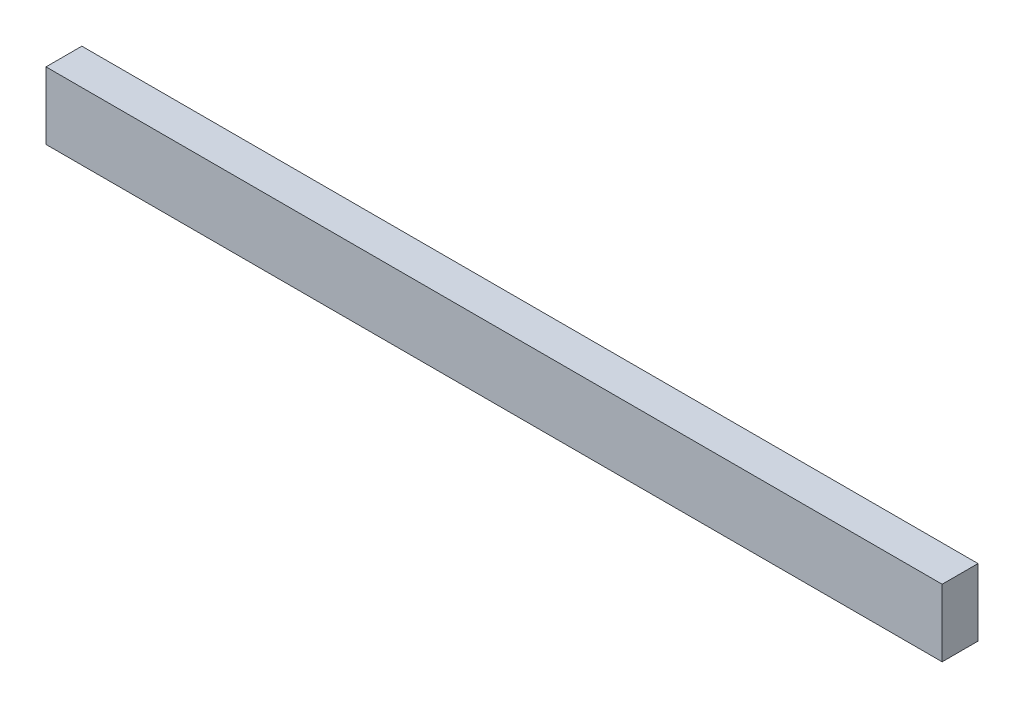
ISO-10303-21;
HEADER;
FILE_DESCRIPTION(('STEP AP214'),'2;1');
FILE_NAME('part.step','',(''),(''),'','','');
FILE_SCHEMA(('AUTOMOTIVE_DESIGN { 1 0 10303 214 1 1 1 1 }'));
ENDSEC;
DATA;
#1=APPLICATION_CONTEXT('core data for automotive mechanical design processes');
#2=APPLICATION_PROTOCOL_DEFINITION('international standard','automotive_design',2000,#1);
#3=PRODUCT_CONTEXT('',#1,'mechanical');
#4=PRODUCT('Part','Part','',(#3));
#5=PRODUCT_RELATED_PRODUCT_CATEGORY('part','',(#4));
#6=PRODUCT_DEFINITION_FORMATION('','',#4);
#7=PRODUCT_DEFINITION_CONTEXT('part definition',#1,'design');
#8=PRODUCT_DEFINITION('design','',#6,#7);
#9=PRODUCT_DEFINITION_SHAPE('','',#8);
#10=(LENGTH_UNIT() NAMED_UNIT(*) SI_UNIT(.MILLI.,.METRE.));
#11=(NAMED_UNIT(*) PLANE_ANGLE_UNIT() SI_UNIT($,.RADIAN.));
#12=(NAMED_UNIT(*) SI_UNIT($,.STERADIAN.) SOLID_ANGLE_UNIT());
#13=UNCERTAINTY_MEASURE_WITH_UNIT(LENGTH_MEASURE(1.E-05),#10,'distance_accuracy_value','');
#14=(GEOMETRIC_REPRESENTATION_CONTEXT(3) GLOBAL_UNCERTAINTY_ASSIGNED_CONTEXT((#13)) GLOBAL_UNIT_ASSIGNED_CONTEXT((#10,
#11,#12)) REPRESENTATION_CONTEXT('',''));
#15=CARTESIAN_POINT('',(0.,0.,0.));
#16=DIRECTION('',(0.,0.,1.));
#17=DIRECTION('',(1.,0.,0.));
#18=AXIS2_PLACEMENT_3D('',#15,#16,#17);
#19=CARTESIAN_POINT('',(125.,9.375,10.));
#20=DIRECTION('',(-1.,0.,0.));
#21=DIRECTION('',(0.,0.,1.));
#22=AXIS2_PLACEMENT_3D('',#19,#20,#21);
#23=PLANE('',#22);
#24=DIRECTION('',(0.,1.,0.));
#25=VECTOR('',#24,1.);
#26=CARTESIAN_POINT('',(125.,9.375,0.));
#27=LINE('',#26,#25);
#28=CARTESIAN_POINT('',(125.,-9.375,0.));
#29=VERTEX_POINT('',#28);
#30=CARTESIAN_POINT('',(125.,9.375,0.));
#31=VERTEX_POINT('',#30);
#32=EDGE_CURVE('E102',#29,#31,#27,.T.);
#33=ORIENTED_EDGE('',*,*,#32,.T.);
#34=DIRECTION('',(0.,0.,-1.));
#35=VECTOR('',#34,1.);
#36=CARTESIAN_POINT('',(125.,9.375,10.));
#37=LINE('',#36,#35);
#38=CARTESIAN_POINT('',(125.,9.375,10.));
#39=VERTEX_POINT('',#38);
#40=EDGE_CURVE('E11',#39,#31,#37,.T.);
#41=ORIENTED_EDGE('',*,*,#40,.F.);
#42=DIRECTION('',(0.,1.,0.));
#43=VECTOR('',#42,1.);
#44=CARTESIAN_POINT('',(125.,9.375,10.));
#45=LINE('',#44,#43);
#46=CARTESIAN_POINT('',(125.,-9.375,10.));
#47=VERTEX_POINT('',#46);
#48=EDGE_CURVE('E90',#47,#39,#45,.T.);
#49=ORIENTED_EDGE('',*,*,#48,.F.);
#50=DIRECTION('',(0.,0.,-1.));
#51=VECTOR('',#50,1.);
#52=CARTESIAN_POINT('',(125.,-9.375,10.));
#53=LINE('',#52,#51);
#54=EDGE_CURVE('E98',#47,#29,#53,.T.);
#55=ORIENTED_EDGE('',*,*,#54,.T.);
#56=EDGE_LOOP('',(#33,#41,#49,#55));
#57=FACE_BOUND('',#56,.T.);
#58=ADVANCED_FACE('F39',(#57),#23,.F.);
#59=CARTESIAN_POINT('',(-125.,9.375,10.));
#60=DIRECTION('',(0.,-1.,0.));
#61=DIRECTION('',(0.,0.,-1.));
#62=AXIS2_PLACEMENT_3D('',#59,#60,#61);
#63=PLANE('',#62);
#64=DIRECTION('',(-1.,0.,0.));
#65=VECTOR('',#64,1.);
#66=CARTESIAN_POINT('',(-125.,9.375,0.));
#67=LINE('',#66,#65);
#68=CARTESIAN_POINT('',(-125.,9.375,0.));
#69=VERTEX_POINT('',#68);
#70=EDGE_CURVE('E94',#31,#69,#67,.T.);
#71=ORIENTED_EDGE('',*,*,#70,.T.);
#72=DIRECTION('',(0.,0.,-1.));
#73=VECTOR('',#72,1.);
#74=CARTESIAN_POINT('',(-125.,9.375,10.));
#75=LINE('',#74,#73);
#76=CARTESIAN_POINT('',(-125.,9.375,10.));
#77=VERTEX_POINT('',#76);
#78=EDGE_CURVE('E47',#77,#69,#75,.T.);
#79=ORIENTED_EDGE('',*,*,#78,.F.);
#80=DIRECTION('',(-1.,0.,0.));
#81=VECTOR('',#80,1.);
#82=CARTESIAN_POINT('',(-125.,9.375,10.));
#83=LINE('',#82,#81);
#84=EDGE_CURVE('E85',#39,#77,#83,.T.);
#85=ORIENTED_EDGE('',*,*,#84,.F.);
#86=ORIENTED_EDGE('',*,*,#40,.T.);
#87=EDGE_LOOP('',(#71,#79,#85,#86));
#88=FACE_BOUND('',#87,.T.);
#89=ADVANCED_FACE('F93',(#88),#63,.F.);
#90=CARTESIAN_POINT('',(-125.,9.375,10.));
#91=DIRECTION('',(1.,0.,0.));
#92=DIRECTION('',(0.,0.,-1.));
#93=AXIS2_PLACEMENT_3D('',#90,#91,#92);
#94=PLANE('',#93);
#95=DIRECTION('',(0.,-1.,0.));
#96=VECTOR('',#95,1.);
#97=CARTESIAN_POINT('',(-125.,9.375,0.));
#98=LINE('',#97,#96);
#99=CARTESIAN_POINT('',(-125.,-9.375,0.));
#100=VERTEX_POINT('',#99);
#101=EDGE_CURVE('E72',#69,#100,#98,.T.);
#102=ORIENTED_EDGE('',*,*,#101,.T.);
#103=DIRECTION('',(0.,0.,-1.));
#104=VECTOR('',#103,1.);
#105=CARTESIAN_POINT('',(-125.,-9.375,10.));
#106=LINE('',#105,#104);
#107=CARTESIAN_POINT('',(-125.,-9.375,10.));
#108=VERTEX_POINT('',#107);
#109=EDGE_CURVE('E95',#108,#100,#106,.T.);
#110=ORIENTED_EDGE('',*,*,#109,.F.);
#111=DIRECTION('',(0.,-1.,0.));
#112=VECTOR('',#111,1.);
#113=CARTESIAN_POINT('',(-125.,9.375,10.));
#114=LINE('',#113,#112);
#115=EDGE_CURVE('E88',#77,#108,#114,.T.);
#116=ORIENTED_EDGE('',*,*,#115,.F.);
#117=ORIENTED_EDGE('',*,*,#78,.T.);
#118=EDGE_LOOP('',(#102,#110,#116,#117));
#119=FACE_BOUND('',#118,.T.);
#120=ADVANCED_FACE('F96',(#119),#94,.F.);
#121=CARTESIAN_POINT('',(-125.,-9.375,10.));
#122=DIRECTION('',(0.,1.,0.));
#123=DIRECTION('',(0.,0.,1.));
#124=AXIS2_PLACEMENT_3D('',#121,#122,#123);
#125=PLANE('',#124);
#126=DIRECTION('',(1.,0.,0.));
#127=VECTOR('',#126,1.);
#128=CARTESIAN_POINT('',(-125.,-9.375,0.));
#129=LINE('',#128,#127);
#130=EDGE_CURVE('E78',#100,#29,#129,.T.);
#131=ORIENTED_EDGE('',*,*,#130,.T.);
#132=ORIENTED_EDGE('',*,*,#54,.F.);
#133=DIRECTION('',(1.,0.,0.));
#134=VECTOR('',#133,1.);
#135=CARTESIAN_POINT('',(-125.,-9.375,10.));
#136=LINE('',#135,#134);
#137=EDGE_CURVE('E55',#108,#47,#136,.T.);
#138=ORIENTED_EDGE('',*,*,#137,.F.);
#139=ORIENTED_EDGE('',*,*,#109,.T.);
#140=EDGE_LOOP('',(#131,#132,#138,#139));
#141=FACE_BOUND('',#140,.T.);
#142=ADVANCED_FACE('F109',(#141),#125,.F.);
#143=CARTESIAN_POINT('',(0.,0.,10.));
#144=DIRECTION('',(0.,0.,1.));
#145=DIRECTION('',(1.,0.,0.));
#146=AXIS2_PLACEMENT_3D('',#143,#144,#145);
#147=PLANE('',#146);
#148=ORIENTED_EDGE('',*,*,#48,.T.);
#149=ORIENTED_EDGE('',*,*,#84,.T.);
#150=ORIENTED_EDGE('',*,*,#115,.T.);
#151=ORIENTED_EDGE('',*,*,#137,.T.);
#152=EDGE_LOOP('',(#148,#149,#150,#151));
#153=FACE_BOUND('',#152,.T.);
#154=ADVANCED_FACE('F86',(#153),#147,.T.);
#155=CARTESIAN_POINT('',(0.,0.,0.));
#156=DIRECTION('',(0.,0.,1.));
#157=DIRECTION('',(1.,0.,0.));
#158=AXIS2_PLACEMENT_3D('',#155,#156,#157);
#159=PLANE('',#158);
#160=ORIENTED_EDGE('',*,*,#32,.F.);
#161=ORIENTED_EDGE('',*,*,#130,.F.);
#162=ORIENTED_EDGE('',*,*,#101,.F.);
#163=ORIENTED_EDGE('',*,*,#70,.F.);
#164=EDGE_LOOP('',(#160,#161,#162,#163));
#165=FACE_BOUND('',#164,.T.);
#166=ADVANCED_FACE('F112',(#165),#159,.F.);
#167=CLOSED_SHELL('',(#58,#89,#120,#142,#154,#166));
#168=MANIFOLD_SOLID_BREP('B2',#167);
#169=ADVANCED_BREP_SHAPE_REPRESENTATION('',(#18,#168),#14);
#170=SHAPE_DEFINITION_REPRESENTATION(#9,#169);
ENDSEC;
END-ISO-10303-21;
